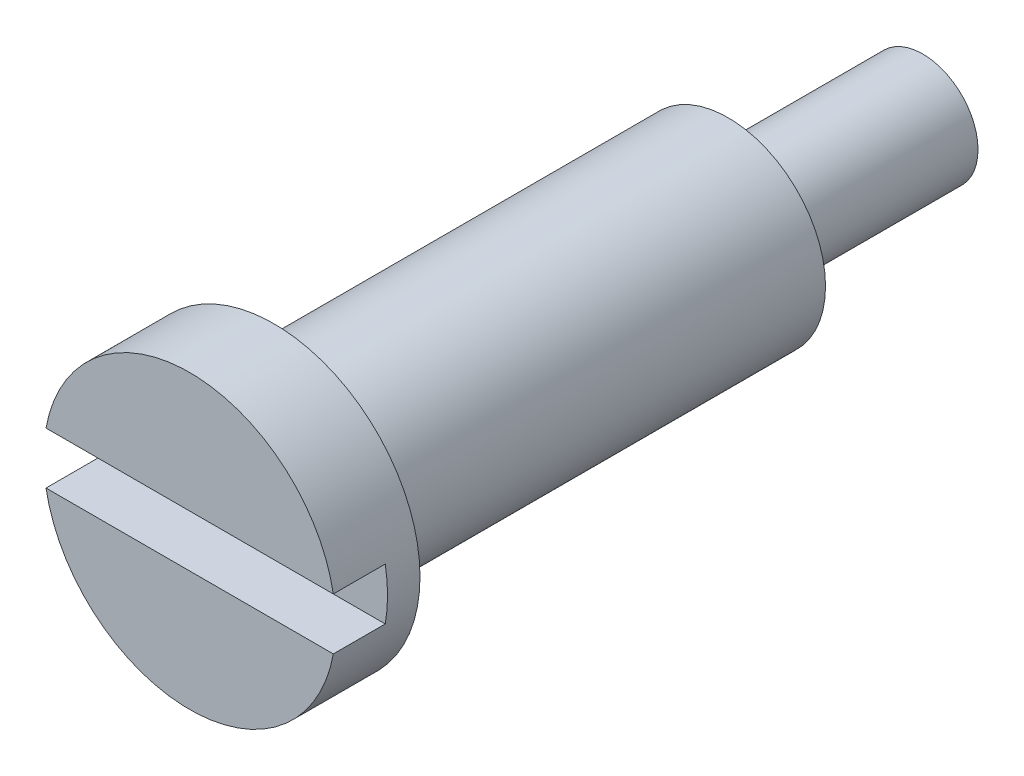
ISO-10303-21;
HEADER;
FILE_DESCRIPTION(('STEP AP214'),'2;1');
FILE_NAME('part.step','',(''),(''),'','','');
FILE_SCHEMA(('AUTOMOTIVE_DESIGN { 1 0 10303 214 1 1 1 1 }'));
ENDSEC;
DATA;
#1=APPLICATION_CONTEXT('core data for automotive mechanical design processes');
#2=APPLICATION_PROTOCOL_DEFINITION('international standard','automotive_design',2000,#1);
#3=PRODUCT_CONTEXT('',#1,'mechanical');
#4=PRODUCT('Part','Part','',(#3));
#5=PRODUCT_RELATED_PRODUCT_CATEGORY('part','',(#4));
#6=PRODUCT_DEFINITION_FORMATION('','',#4);
#7=PRODUCT_DEFINITION_CONTEXT('part definition',#1,'design');
#8=PRODUCT_DEFINITION('design','',#6,#7);
#9=PRODUCT_DEFINITION_SHAPE('','',#8);
#10=(LENGTH_UNIT() NAMED_UNIT(*) SI_UNIT(.MILLI.,.METRE.));
#11=(NAMED_UNIT(*) PLANE_ANGLE_UNIT() SI_UNIT($,.RADIAN.));
#12=(NAMED_UNIT(*) SI_UNIT($,.STERADIAN.) SOLID_ANGLE_UNIT());
#13=UNCERTAINTY_MEASURE_WITH_UNIT(LENGTH_MEASURE(1.E-05),#10,'distance_accuracy_value','');
#14=(GEOMETRIC_REPRESENTATION_CONTEXT(3) GLOBAL_UNCERTAINTY_ASSIGNED_CONTEXT((#13)) GLOBAL_UNIT_ASSIGNED_CONTEXT((#10,
#11,#12)) REPRESENTATION_CONTEXT('',''));
#15=CARTESIAN_POINT('',(0.,0.,0.));
#16=DIRECTION('',(0.,0.,1.));
#17=DIRECTION('',(1.,0.,0.));
#18=AXIS2_PLACEMENT_3D('',#15,#16,#17);
#19=CARTESIAN_POINT('',(0.,0.,1.3));
#20=DIRECTION('',(0.,0.,0.999999999999999));
#21=DIRECTION('',(0.999999999999999,0.,0.));
#22=AXIS2_PLACEMENT_3D('',#19,#20,#21);
#23=PLANE('',#22);
#24=DIRECTION('',(0.999999999999999,0.,0.));
#25=VECTOR('',#24,1.);
#26=CARTESIAN_POINT('',(0.,-0.399999999999998,1.3));
#27=LINE('',#26,#25);
#28=CARTESIAN_POINT('',(-2.21415898254845,-0.399999999999998,1.3));
#29=VERTEX_POINT('',#28);
#30=CARTESIAN_POINT('',(2.21415898254843,-0.399999999999984,1.30000000000001));
#31=VERTEX_POINT('',#30);
#32=EDGE_CURVE('E88',#29,#31,#27,.T.);
#33=ORIENTED_EDGE('',*,*,#32,.F.);
#34=CARTESIAN_POINT('',(0.,0.,1.3));
#35=DIRECTION('',(0.,0.,0.999999999999999));
#36=DIRECTION('',(0.999999999999999,0.,0.));
#37=AXIS2_PLACEMENT_3D('',#34,#35,#36);
#38=CIRCLE('',#37,2.25);
#39=EDGE_CURVE('E100',#29,#31,#38,.T.);
#40=ORIENTED_EDGE('',*,*,#39,.T.);
#41=EDGE_LOOP('',(#33,#40));
#42=FACE_BOUND('',#41,.T.);
#43=ADVANCED_FACE('F38',(#42),#23,.T.);
#44=CARTESIAN_POINT('',(0.,0.,1.3));
#45=DIRECTION('',(0.,0.,-0.999999999999999));
#46=DIRECTION('',(-0.999999999999999,0.,0.));
#47=AXIS2_PLACEMENT_3D('',#44,#45,#46);
#48=CYLINDRICAL_SURFACE('',#47,2.25);
#49=ORIENTED_EDGE('',*,*,#39,.F.);
#50=DIRECTION('',(0.,0.,-0.999999999999999));
#51=VECTOR('',#50,1.);
#52=CARTESIAN_POINT('',(-2.21415898254845,-0.399999999999998,1.3));
#53=LINE('',#52,#51);
#54=CARTESIAN_POINT('',(-2.21415898254846,-0.399999999999991,0.5));
#55=VERTEX_POINT('',#54);
#56=EDGE_CURVE('E106',#29,#55,#53,.T.);
#57=ORIENTED_EDGE('',*,*,#56,.T.);
#58=CARTESIAN_POINT('',(0.,0.,0.5));
#59=DIRECTION('',(0.,0.,0.999999999999999));
#60=DIRECTION('',(0.999999999999999,0.,0.));
#61=AXIS2_PLACEMENT_3D('',#58,#59,#60);
#62=CIRCLE('',#61,2.25);
#63=CARTESIAN_POINT('',(-2.21415898254847,0.400000000000046,0.500000000000049));
#64=VERTEX_POINT('',#63);
#65=EDGE_CURVE('E96',#64,#55,#62,.T.);
#66=ORIENTED_EDGE('',*,*,#65,.F.);
#67=DIRECTION('',(0.,0.,-0.999999999999999));
#68=VECTOR('',#67,1.);
#69=CARTESIAN_POINT('',(-2.21415898254847,0.400000000000039,1.30000000000006));
#70=LINE('',#69,#68);
#71=CARTESIAN_POINT('',(-2.21415898254847,0.400000000000039,1.30000000000006));
#72=VERTEX_POINT('',#71);
#73=EDGE_CURVE('E83',#64,#72,#70,.F.);
#74=ORIENTED_EDGE('',*,*,#73,.T.);
#75=CARTESIAN_POINT('',(2.21415898254845,0.399999999999998,1.3));
#76=VERTEX_POINT('',#75);
#77=EDGE_CURVE('E89',#76,#72,#38,.T.);
#78=ORIENTED_EDGE('',*,*,#77,.F.);
#79=DIRECTION('',(0.,0.,-0.999999999999999));
#80=VECTOR('',#79,1.);
#81=CARTESIAN_POINT('',(2.21415898254845,0.399999999999998,1.3));
#82=LINE('',#81,#80);
#83=CARTESIAN_POINT('',(2.21415898254845,0.400000000000011,0.499999999999994));
#84=VERTEX_POINT('',#83);
#85=EDGE_CURVE('E55',#76,#84,#82,.T.);
#86=ORIENTED_EDGE('',*,*,#85,.T.);
#87=CARTESIAN_POINT('',(2.21415898254843,-0.39999999999997,0.500000000000014));
#88=VERTEX_POINT('',#87);
#89=EDGE_CURVE('E42',#88,#84,#62,.T.);
#90=ORIENTED_EDGE('',*,*,#89,.F.);
#91=DIRECTION('',(0.,0.,-0.999999999999999));
#92=VECTOR('',#91,1.);
#93=CARTESIAN_POINT('',(2.21415898254843,-0.399999999999984,1.30000000000001));
#94=LINE('',#93,#92);
#95=EDGE_CURVE('E63',#88,#31,#94,.F.);
#96=ORIENTED_EDGE('',*,*,#95,.T.);
#97=EDGE_LOOP('',(#49,#57,#66,#74,#78,#86,#90,#96));
#98=FACE_BOUND('',#97,.T.);
#99=CARTESIAN_POINT('',(0.,0.,0.));
#100=DIRECTION('',(0.,0.,0.999999999999999));
#101=DIRECTION('',(0.999999999999999,0.,0.));
#102=AXIS2_PLACEMENT_3D('',#99,#100,#101);
#103=CIRCLE('',#102,2.25);
#104=CARTESIAN_POINT('',(2.25,0.,0.));
#105=VERTEX_POINT('',#104);
#106=EDGE_CURVE('E103',#105,#105,#103,.T.);
#107=ORIENTED_EDGE('',*,*,#106,.T.);
#108=EDGE_LOOP('',(#107));
#109=FACE_BOUND('',#108,.T.);
#110=ADVANCED_FACE('F40',(#98,#109),#48,.T.);
#111=DIRECTION('',(-0.999999999999999,0.,0.));
#112=VECTOR('',#111,1.);
#113=CARTESIAN_POINT('',(0.,0.400000000000032,1.30000000000002));
#114=LINE('',#113,#112);
#115=EDGE_CURVE('E80',#76,#72,#114,.T.);
#116=ORIENTED_EDGE('',*,*,#115,.F.);
#117=ORIENTED_EDGE('',*,*,#77,.T.);
#118=EDGE_LOOP('',(#116,#117));
#119=FACE_BOUND('',#118,.T.);
#120=ADVANCED_FACE('F99',(#119),#23,.T.);
#121=CARTESIAN_POINT('',(0.,0.,0.));
#122=DIRECTION('',(0.,0.,0.999999999999999));
#123=DIRECTION('',(0.999999999999999,0.,0.));
#124=AXIS2_PLACEMENT_3D('',#121,#122,#123);
#125=PLANE('',#124);
#126=CARTESIAN_POINT('',(0.,0.,0.));
#127=DIRECTION('',(0.,0.,-0.999999999999999));
#128=DIRECTION('',(-0.999999999999999,0.,0.));
#129=AXIS2_PLACEMENT_3D('',#126,#127,#128);
#130=CIRCLE('',#129,1.5);
#131=CARTESIAN_POINT('',(1.5,0.,0.));
#132=VERTEX_POINT('',#131);
#133=EDGE_CURVE('E47',#132,#132,#130,.T.);
#134=ORIENTED_EDGE('',*,*,#133,.F.);
#135=EDGE_LOOP('',(#134));
#136=FACE_BOUND('',#135,.T.);
#137=ORIENTED_EDGE('',*,*,#106,.F.);
#138=EDGE_LOOP('',(#137));
#139=FACE_BOUND('',#138,.T.);
#140=ADVANCED_FACE('F131',(#136,#139),#125,.F.);
#141=CARTESIAN_POINT('',(0.,0.,0.5));
#142=DIRECTION('',(0.,0.,0.999999999999999));
#143=DIRECTION('',(0.999999999999999,0.,0.));
#144=AXIS2_PLACEMENT_3D('',#141,#142,#143);
#145=PLANE('',#144);
#146=ORIENTED_EDGE('',*,*,#65,.T.);
#147=DIRECTION('',(0.999999999999999,0.,0.));
#148=VECTOR('',#147,1.);
#149=CARTESIAN_POINT('',(-2.44501872264126,-0.399999999999984,0.500000000000056));
#150=LINE('',#149,#148);
#151=EDGE_CURVE('E97',#55,#88,#150,.T.);
#152=ORIENTED_EDGE('',*,*,#151,.T.);
#153=ORIENTED_EDGE('',*,*,#89,.T.);
#154=DIRECTION('',(-0.999999999999999,0.,0.));
#155=VECTOR('',#154,1.);
#156=CARTESIAN_POINT('',(-2.44501872264122,0.399999999999998,0.5));
#157=LINE('',#156,#155);
#158=EDGE_CURVE('E119',#84,#64,#157,.T.);
#159=ORIENTED_EDGE('',*,*,#158,.T.);
#160=EDGE_LOOP('',(#146,#152,#153,#159));
#161=FACE_BOUND('',#160,.T.);
#162=ADVANCED_FACE('F135',(#161),#145,.T.);
#163=CARTESIAN_POINT('',(-2.44501872264126,-0.399999999999984,0.500000000000056));
#164=DIRECTION('',(0.,-1.,0.));
#165=DIRECTION('',(0.,0.,-0.999999999999999));
#166=AXIS2_PLACEMENT_3D('',#163,#164,#165);
#167=PLANE('',#166);
#168=ORIENTED_EDGE('',*,*,#32,.T.);
#169=ORIENTED_EDGE('',*,*,#95,.F.);
#170=ORIENTED_EDGE('',*,*,#151,.F.);
#171=ORIENTED_EDGE('',*,*,#56,.F.);
#172=EDGE_LOOP('',(#168,#169,#170,#171));
#173=FACE_BOUND('',#172,.T.);
#174=ADVANCED_FACE('F122',(#173),#167,.F.);
#175=CARTESIAN_POINT('',(-2.44501872264122,0.399999999999998,0.5));
#176=DIRECTION('',(0.,1.,0.));
#177=DIRECTION('',(0.,0.,0.999999999999999));
#178=AXIS2_PLACEMENT_3D('',#175,#176,#177);
#179=PLANE('',#178);
#180=ORIENTED_EDGE('',*,*,#115,.T.);
#181=ORIENTED_EDGE('',*,*,#73,.F.);
#182=ORIENTED_EDGE('',*,*,#158,.F.);
#183=ORIENTED_EDGE('',*,*,#85,.F.);
#184=EDGE_LOOP('',(#180,#181,#182,#183));
#185=FACE_BOUND('',#184,.T.);
#186=ADVANCED_FACE('F82',(#185),#179,.F.);
#187=CARTESIAN_POINT('',(0.,0.,-6.99999999999999));
#188=DIRECTION('',(0.,0.,0.999999999999999));
#189=DIRECTION('',(0.999999999999999,0.,0.));
#190=AXIS2_PLACEMENT_3D('',#187,#188,#189);
#191=CYLINDRICAL_SURFACE('',#190,1.5);
#192=CARTESIAN_POINT('',(0.,0.,-6.99999999999999));
#193=DIRECTION('',(0.,0.,-0.999999999999999));
#194=DIRECTION('',(-0.999999999999999,0.,0.));
#195=AXIS2_PLACEMENT_3D('',#192,#193,#194);
#196=CIRCLE('',#195,1.5);
#197=CARTESIAN_POINT('',(1.5,0.,-6.99999999999999));
#198=VERTEX_POINT('',#197);
#199=EDGE_CURVE('E118',#198,#198,#196,.T.);
#200=CARTESIAN_POINT('',(1.5,0.,-6.99999999999999));
#201=CARTESIAN_POINT('',(1.5,0.,-6.92708333333333));
#202=CARTESIAN_POINT('',(1.5,0.,-6.85416666666666));
#203=CARTESIAN_POINT('',(1.5,0.,-6.70833333333333));
#204=CARTESIAN_POINT('',(1.5,0.,-6.63541666666666));
#205=CARTESIAN_POINT('',(1.5,0.,-6.48958333333333));
#206=CARTESIAN_POINT('',(1.5,0.,-6.41666666666666));
#207=CARTESIAN_POINT('',(1.5,0.,-6.27083333333333));
#208=CARTESIAN_POINT('',(1.5,0.,-6.19791666666666));
#209=CARTESIAN_POINT('',(1.5,0.,-6.05208333333333));
#210=CARTESIAN_POINT('',(1.5,0.,-5.97916666666666));
#211=CARTESIAN_POINT('',(1.5,0.,-5.83333333333333));
#212=CARTESIAN_POINT('',(1.5,0.,-5.76041666666666));
#213=CARTESIAN_POINT('',(1.5,0.,-5.61458333333333));
#214=CARTESIAN_POINT('',(1.5,0.,-5.54166666666666));
#215=CARTESIAN_POINT('',(1.5,0.,-5.39583333333333));
#216=CARTESIAN_POINT('',(1.5,0.,-5.32291666666666));
#217=CARTESIAN_POINT('',(1.5,0.,-5.17708333333333));
#218=CARTESIAN_POINT('',(1.5,0.,-5.10416666666666));
#219=CARTESIAN_POINT('',(1.5,0.,-4.95833333333333));
#220=CARTESIAN_POINT('',(1.5,0.,-4.88541666666666));
#221=CARTESIAN_POINT('',(1.5,0.,-4.73958333333333));
#222=CARTESIAN_POINT('',(1.5,0.,-4.66666666666666));
#223=CARTESIAN_POINT('',(1.5,0.,-4.52083333333333));
#224=CARTESIAN_POINT('',(1.5,0.,-4.44791666666666));
#225=CARTESIAN_POINT('',(1.5,0.,-4.30208333333333));
#226=CARTESIAN_POINT('',(1.5,0.,-4.22916666666666));
#227=CARTESIAN_POINT('',(1.5,0.,-4.08333333333333));
#228=CARTESIAN_POINT('',(1.5,0.,-4.01041666666666));
#229=CARTESIAN_POINT('',(1.5,0.,-3.86458333333333));
#230=CARTESIAN_POINT('',(1.5,0.,-3.79166666666666));
#231=CARTESIAN_POINT('',(1.5,0.,-3.64583333333333));
#232=CARTESIAN_POINT('',(1.5,0.,-3.57291666666666));
#233=CARTESIAN_POINT('',(1.5,0.,-3.42708333333333));
#234=CARTESIAN_POINT('',(1.5,0.,-3.35416666666666));
#235=CARTESIAN_POINT('',(1.5,0.,-3.20833333333333));
#236=CARTESIAN_POINT('',(1.5,0.,-3.13541666666666));
#237=CARTESIAN_POINT('',(1.5,0.,-2.98958333333333));
#238=CARTESIAN_POINT('',(1.5,0.,-2.91666666666666));
#239=CARTESIAN_POINT('',(1.5,0.,-2.77083333333333));
#240=CARTESIAN_POINT('',(1.5,0.,-2.69791666666666));
#241=CARTESIAN_POINT('',(1.5,0.,-2.55208333333333));
#242=CARTESIAN_POINT('',(1.5,0.,-2.47916666666666));
#243=CARTESIAN_POINT('',(1.5,0.,-2.33333333333333));
#244=CARTESIAN_POINT('',(1.5,0.,-2.26041666666666));
#245=CARTESIAN_POINT('',(1.5,0.,-2.11458333333333));
#246=CARTESIAN_POINT('',(1.5,0.,-2.04166666666666));
#247=CARTESIAN_POINT('',(1.5,0.,-1.89583333333333));
#248=CARTESIAN_POINT('',(1.5,0.,-1.82291666666666));
#249=CARTESIAN_POINT('',(1.5,0.,-1.67708333333333));
#250=CARTESIAN_POINT('',(1.5,0.,-1.60416666666666));
#251=CARTESIAN_POINT('',(1.5,0.,-1.45833333333333));
#252=CARTESIAN_POINT('',(1.5,0.,-1.38541666666667));
#253=CARTESIAN_POINT('',(1.5,0.,-1.23958333333333));
#254=CARTESIAN_POINT('',(1.5,0.,-1.16666666666666));
#255=CARTESIAN_POINT('',(1.5,0.,-1.02083333333333));
#256=CARTESIAN_POINT('',(1.5,0.,-0.947916666666666));
#257=CARTESIAN_POINT('',(1.5,0.,-0.802083333333332));
#258=CARTESIAN_POINT('',(1.5,0.,-0.729166666666666));
#259=CARTESIAN_POINT('',(1.5,0.,-0.583333333333332));
#260=CARTESIAN_POINT('',(1.5,0.,-0.510416666666666));
#261=CARTESIAN_POINT('',(1.5,0.,-0.364583333333333));
#262=CARTESIAN_POINT('',(1.5,0.,-0.291666666666667));
#263=CARTESIAN_POINT('',(1.5,0.,-0.145833333333333));
#264=CARTESIAN_POINT('',(1.5,0.,-0.0729166666666667));
#265=CARTESIAN_POINT('',(1.5,0.,0.));
#266=B_SPLINE_CURVE_WITH_KNOTS('',3,(#200,#201,#202,#203,#204,#205,#206,#207,#208,#209,#210,
#211,#212,#213,#214,#215,#216,#217,#218,#219,#220,#221,#222,#223,#224,#225,#226,#227,#228,#229,
#230,#231,#232,#233,#234,#235,#236,#237,#238,#239,#240,#241,#242,#243,#244,#245,#246,#247,#248,
#249,#250,#251,#252,#253,#254,#255,#256,#257,#258,#259,#260,#261,#262,#263,#264,#265),
.UNSPECIFIED.,.F.,.F.,(4,2,2,2,2,2,2,2,2,2,2,2,2,2,2,2,2,2,2,2,2,2,2,2,2,2,2,2,2,2,2,2,4),(0.,
0.21875,0.4375,0.65625,0.874999999999999,1.09375,1.3125,1.53125,1.75,1.96875,2.1875,2.40625,
2.625,2.84375,3.0625,3.28125,3.5,3.71875,3.9375,4.15624999999999,4.375,4.59375,4.81249999999999,
5.03124999999999,5.25,5.46874999999999,5.68749999999999,5.90624999999999,6.12499999999999,
6.34374999999999,6.56249999999999,6.78124999999999,6.99999999999999),.UNSPECIFIED.);
#267=EDGE_CURVE('BSEAM148',#198,#132,#266,.T.);
#268=ORIENTED_EDGE('',*,*,#199,.F.);
#269=ORIENTED_EDGE('',*,*,#133,.T.);
#270=ORIENTED_EDGE('',*,*,#267,.T.);
#271=ORIENTED_EDGE('',*,*,#267,.F.);
#272=EDGE_LOOP('',(#268,#270,#269,#271));
#273=FACE_BOUND('',#272,.T.);
#274=ADVANCED_FACE('F148',(#273),#191,.T.);
#275=CARTESIAN_POINT('',(0.,0.,-6.99999999999999));
#276=DIRECTION('',(0.,0.,-0.999999999999999));
#277=DIRECTION('',(-0.999999999999999,0.,0.));
#278=AXIS2_PLACEMENT_3D('',#275,#276,#277);
#279=PLANE('',#278);
#280=CARTESIAN_POINT('',(0.,0.,-6.99999999999999));
#281=DIRECTION('',(0.,0.,-0.999999999999999));
#282=DIRECTION('',(-0.999999999999999,0.,0.));
#283=AXIS2_PLACEMENT_3D('',#280,#281,#282);
#284=CIRCLE('',#283,0.85);
#285=CARTESIAN_POINT('',(0.849999999999985,0.,-6.99999999999999));
#286=VERTEX_POINT('',#285);
#287=EDGE_CURVE('E11',#286,#286,#284,.T.);
#288=ORIENTED_EDGE('',*,*,#287,.F.);
#289=EDGE_LOOP('',(#288));
#290=FACE_BOUND('',#289,.T.);
#291=ORIENTED_EDGE('',*,*,#199,.T.);
#292=EDGE_LOOP('',(#291));
#293=FACE_BOUND('',#292,.T.);
#294=ADVANCED_FACE('F154',(#290,#293),#279,.T.);
#295=CARTESIAN_POINT('',(0.,0.,-9.99999999999996));
#296=DIRECTION('',(0.,0.,0.999999999999999));
#297=DIRECTION('',(0.999999999999999,0.,0.));
#298=AXIS2_PLACEMENT_3D('',#295,#296,#297);
#299=CYLINDRICAL_SURFACE('',#298,0.85);
#300=CARTESIAN_POINT('',(0.,0.,-9.99999999999996));
#301=DIRECTION('',(0.,0.,-0.999999999999999));
#302=DIRECTION('',(-0.999999999999999,0.,0.));
#303=AXIS2_PLACEMENT_3D('',#300,#301,#302);
#304=CIRCLE('',#303,0.85);
#305=CARTESIAN_POINT('',(0.849999999999985,0.,-9.99999999999996));
#306=VERTEX_POINT('',#305);
#307=EDGE_CURVE('E164',#306,#306,#304,.T.);
#308=CARTESIAN_POINT('',(0.849999999999985,0.,-9.99999999999996));
#309=CARTESIAN_POINT('',(0.849999999999985,0.,-9.96874999999996));
#310=CARTESIAN_POINT('',(0.849999999999985,0.,-9.93749999999996));
#311=CARTESIAN_POINT('',(0.849999999999985,0.,-9.87499999999996));
#312=CARTESIAN_POINT('',(0.849999999999985,0.,-9.84374999999997));
#313=CARTESIAN_POINT('',(0.849999999999985,0.,-9.78124999999996));
#314=CARTESIAN_POINT('',(0.849999999999985,0.,-9.74999999999996));
#315=CARTESIAN_POINT('',(0.849999999999985,0.,-9.68749999999996));
#316=CARTESIAN_POINT('',(0.849999999999985,0.,-9.65624999999997));
#317=CARTESIAN_POINT('',(0.849999999999985,0.,-9.59374999999997));
#318=CARTESIAN_POINT('',(0.849999999999985,0.,-9.56249999999997));
#319=CARTESIAN_POINT('',(0.849999999999985,0.,-9.49999999999997));
#320=CARTESIAN_POINT('',(0.849999999999985,0.,-9.46874999999997));
#321=CARTESIAN_POINT('',(0.849999999999985,0.,-9.40624999999997));
#322=CARTESIAN_POINT('',(0.849999999999985,0.,-9.37499999999997));
#323=CARTESIAN_POINT('',(0.849999999999985,0.,-9.31249999999997));
#324=CARTESIAN_POINT('',(0.849999999999985,0.,-9.28124999999997));
#325=CARTESIAN_POINT('',(0.849999999999985,0.,-9.21874999999997));
#326=CARTESIAN_POINT('',(0.849999999999985,0.,-9.18749999999997));
#327=CARTESIAN_POINT('',(0.849999999999985,0.,-9.12499999999997));
#328=CARTESIAN_POINT('',(0.849999999999985,0.,-9.09374999999997));
#329=CARTESIAN_POINT('',(0.849999999999985,0.,-9.03124999999997));
#330=CARTESIAN_POINT('',(0.849999999999985,0.,-8.99999999999997));
#331=CARTESIAN_POINT('',(0.849999999999985,0.,-8.93749999999997));
#332=CARTESIAN_POINT('',(0.849999999999985,0.,-8.90624999999997));
#333=CARTESIAN_POINT('',(0.849999999999985,0.,-8.84374999999997));
#334=CARTESIAN_POINT('',(0.849999999999985,0.,-8.81249999999998));
#335=CARTESIAN_POINT('',(0.849999999999985,0.,-8.74999999999998));
#336=CARTESIAN_POINT('',(0.849999999999985,0.,-8.71874999999998));
#337=CARTESIAN_POINT('',(0.849999999999985,0.,-8.65624999999998));
#338=CARTESIAN_POINT('',(0.849999999999985,0.,-8.62499999999998));
#339=CARTESIAN_POINT('',(0.849999999999985,0.,-8.56249999999998));
#340=CARTESIAN_POINT('',(0.849999999999985,0.,-8.53124999999998));
#341=CARTESIAN_POINT('',(0.849999999999985,0.,-8.46874999999998));
#342=CARTESIAN_POINT('',(0.849999999999985,0.,-8.43749999999998));
#343=CARTESIAN_POINT('',(0.849999999999985,0.,-8.37499999999998));
#344=CARTESIAN_POINT('',(0.849999999999985,0.,-8.34374999999998));
#345=CARTESIAN_POINT('',(0.849999999999985,0.,-8.28124999999998));
#346=CARTESIAN_POINT('',(0.849999999999985,0.,-8.24999999999998));
#347=CARTESIAN_POINT('',(0.849999999999985,0.,-8.18749999999998));
#348=CARTESIAN_POINT('',(0.849999999999985,0.,-8.15624999999998));
#349=CARTESIAN_POINT('',(0.849999999999985,0.,-8.09374999999998));
#350=CARTESIAN_POINT('',(0.849999999999985,0.,-8.06249999999998));
#351=CARTESIAN_POINT('',(0.849999999999985,0.,-7.99999999999998));
#352=CARTESIAN_POINT('',(0.849999999999985,0.,-7.96874999999998));
#353=CARTESIAN_POINT('',(0.849999999999985,0.,-7.90624999999998));
#354=CARTESIAN_POINT('',(0.849999999999985,0.,-7.87499999999998));
#355=CARTESIAN_POINT('',(0.849999999999985,0.,-7.81249999999998));
#356=CARTESIAN_POINT('',(0.849999999999985,0.,-7.78124999999998));
#357=CARTESIAN_POINT('',(0.849999999999985,0.,-7.71874999999998));
#358=CARTESIAN_POINT('',(0.849999999999985,0.,-7.68749999999998));
#359=CARTESIAN_POINT('',(0.849999999999985,0.,-7.62499999999999));
#360=CARTESIAN_POINT('',(0.849999999999985,0.,-7.59374999999999));
#361=CARTESIAN_POINT('',(0.849999999999985,0.,-7.53124999999999));
#362=CARTESIAN_POINT('',(0.849999999999985,0.,-7.49999999999999));
#363=CARTESIAN_POINT('',(0.849999999999985,0.,-7.43749999999999));
#364=CARTESIAN_POINT('',(0.849999999999985,0.,-7.40624999999999));
#365=CARTESIAN_POINT('',(0.849999999999985,0.,-7.34374999999999));
#366=CARTESIAN_POINT('',(0.849999999999985,0.,-7.31249999999999));
#367=CARTESIAN_POINT('',(0.849999999999985,0.,-7.24999999999999));
#368=CARTESIAN_POINT('',(0.849999999999985,0.,-7.21874999999999));
#369=CARTESIAN_POINT('',(0.849999999999985,0.,-7.15624999999999));
#370=CARTESIAN_POINT('',(0.849999999999985,0.,-7.12499999999999));
#371=CARTESIAN_POINT('',(0.849999999999985,0.,-7.06249999999999));
#372=CARTESIAN_POINT('',(0.849999999999985,0.,-7.03124999999999));
#373=CARTESIAN_POINT('',(0.849999999999985,0.,-6.99999999999999));
#374=B_SPLINE_CURVE_WITH_KNOTS('',3,(#308,#309,#310,#311,#312,#313,#314,#315,#316,#317,#318,
#319,#320,#321,#322,#323,#324,#325,#326,#327,#328,#329,#330,#331,#332,#333,#334,#335,#336,#337,
#338,#339,#340,#341,#342,#343,#344,#345,#346,#347,#348,#349,#350,#351,#352,#353,#354,#355,#356,
#357,#358,#359,#360,#361,#362,#363,#364,#365,#366,#367,#368,#369,#370,#371,#372,#373),
.UNSPECIFIED.,.F.,.F.,(4,2,2,2,2,2,2,2,2,2,2,2,2,2,2,2,2,2,2,2,2,2,2,2,2,2,2,2,2,2,2,2,4),(0.,
0.0937500000000001,0.187499999999998,0.281249999999999,0.374999999999997,0.468749999999997,
0.562499999999995,0.656249999999995,0.749999999999994,0.843749999999992,0.937499999999992,
1.03124999999999,1.12499999999999,1.21874999999999,1.31249999999999,1.40624999999999,
1.49999999999999,1.59374999999999,1.68749999999998,1.78124999999998,1.87499999999998,
1.96874999999998,2.06249999999998,2.15624999999998,2.24999999999998,2.34374999999998,
2.43749999999998,2.53124999999998,2.62499999999998,2.71874999999997,2.81249999999997,
2.90624999999997,2.99999999999997),.UNSPECIFIED.);
#375=EDGE_CURVE('BSEAM159',#306,#286,#374,.T.);
#376=ORIENTED_EDGE('',*,*,#307,.F.);
#377=ORIENTED_EDGE('',*,*,#287,.T.);
#378=ORIENTED_EDGE('',*,*,#375,.T.);
#379=ORIENTED_EDGE('',*,*,#375,.F.);
#380=EDGE_LOOP('',(#376,#378,#377,#379));
#381=FACE_BOUND('',#380,.T.);
#382=ADVANCED_FACE('F159',(#381),#299,.T.);
#383=CARTESIAN_POINT('',(0.,0.,-9.99999999999996));
#384=DIRECTION('',(0.,0.,-0.999999999999999));
#385=DIRECTION('',(-0.999999999999999,0.,0.));
#386=AXIS2_PLACEMENT_3D('',#383,#384,#385);
#387=PLANE('',#386);
#388=ORIENTED_EDGE('',*,*,#307,.T.);
#389=EDGE_LOOP('',(#388));
#390=FACE_BOUND('',#389,.T.);
#391=ADVANCED_FACE('F169',(#390),#387,.T.);
#392=CLOSED_SHELL('',(#43,#110,#120,#140,#162,#174,#186,#274,#294,#382,#391));
#393=MANIFOLD_SOLID_BREP('B2',#392);
#394=ADVANCED_BREP_SHAPE_REPRESENTATION('',(#18,#393),#14);
#395=SHAPE_DEFINITION_REPRESENTATION(#9,#394);
ENDSEC;
END-ISO-10303-21;
